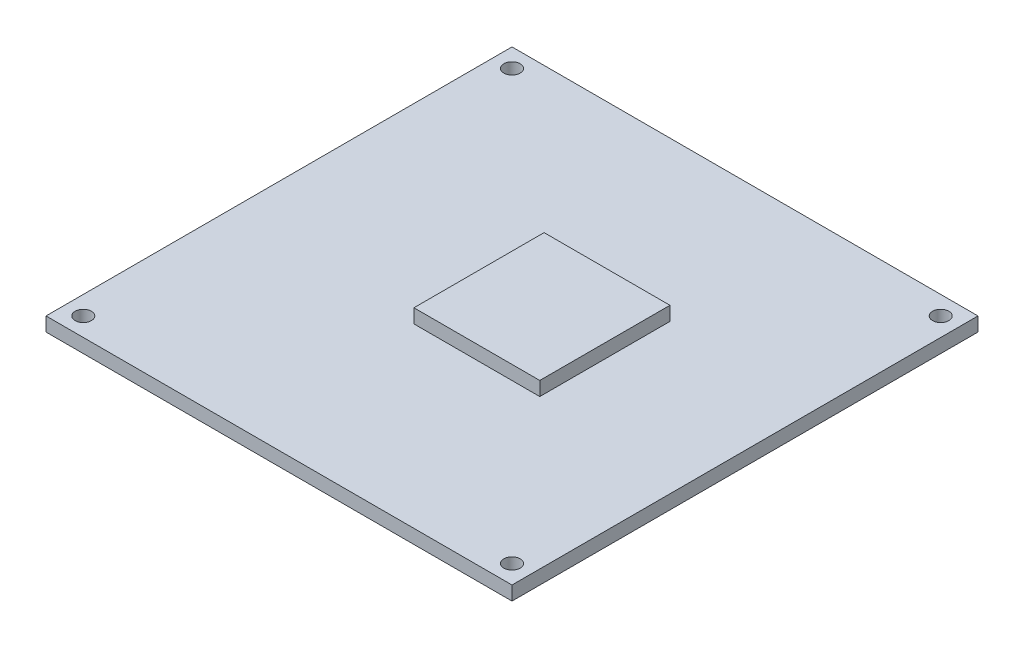
ISO-10303-21;
HEADER;
FILE_DESCRIPTION(('STEP AP214'),'2;1');
FILE_NAME('part.step','',(''),(''),'','','');
FILE_SCHEMA(('AUTOMOTIVE_DESIGN { 1 0 10303 214 1 1 1 1 }'));
ENDSEC;
DATA;
#1=APPLICATION_CONTEXT('core data for automotive mechanical design processes');
#2=APPLICATION_PROTOCOL_DEFINITION('international standard','automotive_design',2000,#1);
#3=PRODUCT_CONTEXT('',#1,'mechanical');
#4=PRODUCT('Part','Part','',(#3));
#5=PRODUCT_RELATED_PRODUCT_CATEGORY('part','',(#4));
#6=PRODUCT_DEFINITION_FORMATION('','',#4);
#7=PRODUCT_DEFINITION_CONTEXT('part definition',#1,'design');
#8=PRODUCT_DEFINITION('design','',#6,#7);
#9=PRODUCT_DEFINITION_SHAPE('','',#8);
#10=(LENGTH_UNIT() NAMED_UNIT(*) SI_UNIT(.MILLI.,.METRE.));
#11=(NAMED_UNIT(*) PLANE_ANGLE_UNIT() SI_UNIT($,.RADIAN.));
#12=(NAMED_UNIT(*) SI_UNIT($,.STERADIAN.) SOLID_ANGLE_UNIT());
#13=UNCERTAINTY_MEASURE_WITH_UNIT(LENGTH_MEASURE(1.E-05),#10,'distance_accuracy_value','');
#14=(GEOMETRIC_REPRESENTATION_CONTEXT(3) GLOBAL_UNCERTAINTY_ASSIGNED_CONTEXT((#13)) GLOBAL_UNIT_ASSIGNED_CONTEXT((#10,
#11,#12)) REPRESENTATION_CONTEXT('',''));
#15=CARTESIAN_POINT('',(0.,0.,0.));
#16=DIRECTION('',(0.,0.,1.));
#17=DIRECTION('',(1.,0.,0.));
#18=AXIS2_PLACEMENT_3D('',#15,#16,#17);
#19=CARTESIAN_POINT('',(0.,3.,0.));
#20=DIRECTION('',(0.,1.,0.));
#21=DIRECTION('',(0.,0.,1.));
#22=AXIS2_PLACEMENT_3D('',#19,#20,#21);
#23=PLANE('',#22);
#24=CARTESIAN_POINT('',(-46.,3.,46.));
#25=DIRECTION('',(0.,1.,0.));
#26=DIRECTION('',(0.,0.,1.));
#27=AXIS2_PLACEMENT_3D('',#24,#25,#26);
#28=CIRCLE('',#27,1.75);
#29=CARTESIAN_POINT('',(-46.,3.,47.75));
#30=VERTEX_POINT('',#29);
#31=EDGE_CURVE('E145',#30,#30,#28,.T.);
#32=ORIENTED_EDGE('',*,*,#31,.F.);
#33=EDGE_LOOP('',(#32));
#34=FACE_BOUND('',#33,.T.);
#35=CARTESIAN_POINT('',(46.,3.,-46.));
#36=DIRECTION('',(0.,1.,0.));
#37=DIRECTION('',(0.,0.,1.));
#38=AXIS2_PLACEMENT_3D('',#35,#36,#37);
#39=CIRCLE('',#38,1.75);
#40=CARTESIAN_POINT('',(46.,3.,-44.25));
#41=VERTEX_POINT('',#40);
#42=EDGE_CURVE('E157',#41,#41,#39,.T.);
#43=ORIENTED_EDGE('',*,*,#42,.F.);
#44=EDGE_LOOP('',(#43));
#45=FACE_BOUND('',#44,.T.);
#46=DIRECTION('',(0.,0.,-1.));
#47=VECTOR('',#46,1.);
#48=CARTESIAN_POINT('',(50.,3.,-50.));
#49=LINE('',#48,#47);
#50=CARTESIAN_POINT('',(50.,3.,50.));
#51=VERTEX_POINT('',#50);
#52=CARTESIAN_POINT('',(50.,3.,-50.));
#53=VERTEX_POINT('',#52);
#54=EDGE_CURVE('E163',#51,#53,#49,.T.);
#55=ORIENTED_EDGE('',*,*,#54,.T.);
#56=DIRECTION('',(-1.,0.,0.));
#57=VECTOR('',#56,1.);
#58=CARTESIAN_POINT('',(-50.,3.,-50.));
#59=LINE('',#58,#57);
#60=CARTESIAN_POINT('',(-50.,3.,-50.));
#61=VERTEX_POINT('',#60);
#62=EDGE_CURVE('E87',#53,#61,#59,.T.);
#63=ORIENTED_EDGE('',*,*,#62,.T.);
#64=DIRECTION('',(0.,0.,1.));
#65=VECTOR('',#64,1.);
#66=CARTESIAN_POINT('',(-50.,3.,-50.));
#67=LINE('',#66,#65);
#68=CARTESIAN_POINT('',(-50.,3.,50.));
#69=VERTEX_POINT('',#68);
#70=EDGE_CURVE('E166',#61,#69,#67,.T.);
#71=ORIENTED_EDGE('',*,*,#70,.T.);
#72=DIRECTION('',(1.,0.,0.));
#73=VECTOR('',#72,1.);
#74=CARTESIAN_POINT('',(-50.,3.,50.));
#75=LINE('',#74,#73);
#76=EDGE_CURVE('E59',#69,#51,#75,.T.);
#77=ORIENTED_EDGE('',*,*,#76,.T.);
#78=EDGE_LOOP('',(#55,#63,#71,#77));
#79=FACE_BOUND('',#78,.T.);
#80=CARTESIAN_POINT('',(46.,3.,46.));
#81=DIRECTION('',(0.,1.,0.));
#82=DIRECTION('',(0.,0.,-1.));
#83=AXIS2_PLACEMENT_3D('',#80,#81,#82);
#84=CIRCLE('',#83,1.75);
#85=CARTESIAN_POINT('',(46.,3.,44.25));
#86=VERTEX_POINT('',#85);
#87=EDGE_CURVE('E151',#86,#86,#84,.T.);
#88=ORIENTED_EDGE('',*,*,#87,.F.);
#89=EDGE_LOOP('',(#88));
#90=FACE_BOUND('',#89,.T.);
#91=CARTESIAN_POINT('',(-46.,3.,-46.));
#92=DIRECTION('',(0.,1.,0.));
#93=DIRECTION('',(0.,0.,-1.));
#94=AXIS2_PLACEMENT_3D('',#91,#92,#93);
#95=CIRCLE('',#94,1.75);
#96=CARTESIAN_POINT('',(-46.,3.,-47.75));
#97=VERTEX_POINT('',#96);
#98=EDGE_CURVE('E137',#97,#97,#95,.T.);
#99=ORIENTED_EDGE('',*,*,#98,.F.);
#100=EDGE_LOOP('',(#99));
#101=FACE_BOUND('',#100,.T.);
#102=DIRECTION('',(1.,0.,0.));
#103=VECTOR('',#102,1.);
#104=CARTESIAN_POINT('',(-9.03983958771448,3.,12.0050234314704));
#105=LINE('',#104,#103);
#106=CARTESIAN_POINT('',(-9.03983958771448,3.,12.0050234314704));
#107=VERTEX_POINT('',#106);
#108=CARTESIAN_POINT('',(17.967257133165,3.,12.0050234314704));
#109=VERTEX_POINT('',#108);
#110=EDGE_CURVE('E333',#107,#109,#105,.T.);
#111=ORIENTED_EDGE('',*,*,#110,.F.);
#112=DIRECTION('',(0.,0.,1.));
#113=VECTOR('',#112,1.);
#114=CARTESIAN_POINT('',(-9.03983958771448,3.,12.0050234314704));
#115=LINE('',#114,#113);
#116=CARTESIAN_POINT('',(-9.03983958771448,3.,-15.9265379854787));
#117=VERTEX_POINT('',#116);
#118=EDGE_CURVE('E132',#117,#107,#115,.T.);
#119=ORIENTED_EDGE('',*,*,#118,.F.);
#120=DIRECTION('',(-1.,0.,0.));
#121=VECTOR('',#120,1.);
#122=CARTESIAN_POINT('',(-9.03983958771448,3.,-15.9265379854787));
#123=LINE('',#122,#121);
#124=CARTESIAN_POINT('',(17.967257133165,3.,-15.9265379854787));
#125=VERTEX_POINT('',#124);
#126=EDGE_CURVE('E128',#125,#117,#123,.T.);
#127=ORIENTED_EDGE('',*,*,#126,.F.);
#128=DIRECTION('',(0.,0.,-1.));
#129=VECTOR('',#128,1.);
#130=CARTESIAN_POINT('',(17.967257133165,3.,12.0050234314704));
#131=LINE('',#130,#129);
#132=EDGE_CURVE('E330',#109,#125,#131,.T.);
#133=ORIENTED_EDGE('',*,*,#132,.F.);
#134=EDGE_LOOP('',(#111,#119,#127,#133));
#135=FACE_BOUND('',#134,.T.);
#136=ADVANCED_FACE('F35',(#34,#45,#79,#90,#101,#135),#23,.T.);
#137=CARTESIAN_POINT('',(0.,0.,0.));
#138=DIRECTION('',(0.,1.,0.));
#139=DIRECTION('',(0.,0.,1.));
#140=AXIS2_PLACEMENT_3D('',#137,#138,#139);
#141=PLANE('',#140);
#142=DIRECTION('',(0.,0.,-1.));
#143=VECTOR('',#142,1.);
#144=CARTESIAN_POINT('',(50.,0.,-50.));
#145=LINE('',#144,#143);
#146=CARTESIAN_POINT('',(50.,0.,50.));
#147=VERTEX_POINT('',#146);
#148=CARTESIAN_POINT('',(50.,0.,-50.));
#149=VERTEX_POINT('',#148);
#150=EDGE_CURVE('E160',#147,#149,#145,.T.);
#151=ORIENTED_EDGE('',*,*,#150,.F.);
#152=DIRECTION('',(1.,0.,0.));
#153=VECTOR('',#152,1.);
#154=CARTESIAN_POINT('',(-50.,0.,50.));
#155=LINE('',#154,#153);
#156=CARTESIAN_POINT('',(-50.,0.,50.));
#157=VERTEX_POINT('',#156);
#158=EDGE_CURVE('E80',#157,#147,#155,.T.);
#159=ORIENTED_EDGE('',*,*,#158,.F.);
#160=DIRECTION('',(0.,0.,1.));
#161=VECTOR('',#160,1.);
#162=CARTESIAN_POINT('',(-50.,0.,-50.));
#163=LINE('',#162,#161);
#164=CARTESIAN_POINT('',(-50.,0.,-50.));
#165=VERTEX_POINT('',#164);
#166=EDGE_CURVE('E174',#165,#157,#163,.T.);
#167=ORIENTED_EDGE('',*,*,#166,.F.);
#168=DIRECTION('',(-1.,0.,0.));
#169=VECTOR('',#168,1.);
#170=CARTESIAN_POINT('',(-50.,0.,-50.));
#171=LINE('',#170,#169);
#172=EDGE_CURVE('E172',#149,#165,#171,.T.);
#173=ORIENTED_EDGE('',*,*,#172,.F.);
#174=EDGE_LOOP('',(#151,#159,#167,#173));
#175=FACE_BOUND('',#174,.T.);
#176=CARTESIAN_POINT('',(46.,0.,-46.));
#177=DIRECTION('',(0.,1.,0.));
#178=DIRECTION('',(0.,0.,1.));
#179=AXIS2_PLACEMENT_3D('',#176,#177,#178);
#180=CIRCLE('',#179,1.75);
#181=CARTESIAN_POINT('',(46.,0.,-44.25));
#182=VERTEX_POINT('',#181);
#183=EDGE_CURVE('E154',#182,#182,#180,.T.);
#184=ORIENTED_EDGE('',*,*,#183,.T.);
#185=EDGE_LOOP('',(#184));
#186=FACE_BOUND('',#185,.T.);
#187=CARTESIAN_POINT('',(46.,0.,46.));
#188=DIRECTION('',(0.,1.,0.));
#189=DIRECTION('',(0.,0.,-1.));
#190=AXIS2_PLACEMENT_3D('',#187,#188,#189);
#191=CIRCLE('',#190,1.75);
#192=CARTESIAN_POINT('',(46.,0.,44.25));
#193=VERTEX_POINT('',#192);
#194=EDGE_CURVE('E148',#193,#193,#191,.T.);
#195=ORIENTED_EDGE('',*,*,#194,.T.);
#196=EDGE_LOOP('',(#195));
#197=FACE_BOUND('',#196,.T.);
#198=CARTESIAN_POINT('',(-46.,0.,46.));
#199=DIRECTION('',(0.,1.,0.));
#200=DIRECTION('',(0.,0.,1.));
#201=AXIS2_PLACEMENT_3D('',#198,#199,#200);
#202=CIRCLE('',#201,1.75);
#203=CARTESIAN_POINT('',(-46.,0.,47.75));
#204=VERTEX_POINT('',#203);
#205=EDGE_CURVE('E143',#204,#204,#202,.T.);
#206=ORIENTED_EDGE('',*,*,#205,.T.);
#207=EDGE_LOOP('',(#206));
#208=FACE_BOUND('',#207,.T.);
#209=CARTESIAN_POINT('',(-46.,0.,-46.));
#210=DIRECTION('',(0.,1.,0.));
#211=DIRECTION('',(0.,0.,-1.));
#212=AXIS2_PLACEMENT_3D('',#209,#210,#211);
#213=CIRCLE('',#212,1.75);
#214=CARTESIAN_POINT('',(-46.,0.,-47.75));
#215=VERTEX_POINT('',#214);
#216=EDGE_CURVE('E134',#215,#215,#213,.T.);
#217=ORIENTED_EDGE('',*,*,#216,.T.);
#218=EDGE_LOOP('',(#217));
#219=FACE_BOUND('',#218,.T.);
#220=ADVANCED_FACE('F187',(#175,#186,#197,#208,#219),#141,.F.);
#221=CARTESIAN_POINT('',(50.,3.,-50.));
#222=DIRECTION('',(-1.,0.,0.));
#223=DIRECTION('',(0.,0.,1.));
#224=AXIS2_PLACEMENT_3D('',#221,#222,#223);
#225=PLANE('',#224);
#226=ORIENTED_EDGE('',*,*,#150,.T.);
#227=DIRECTION('',(0.,-1.,0.));
#228=VECTOR('',#227,1.);
#229=CARTESIAN_POINT('',(50.,3.,-50.));
#230=LINE('',#229,#228);
#231=EDGE_CURVE('E11',#53,#149,#230,.T.);
#232=ORIENTED_EDGE('',*,*,#231,.F.);
#233=ORIENTED_EDGE('',*,*,#54,.F.);
#234=DIRECTION('',(0.,-1.,0.));
#235=VECTOR('',#234,1.);
#236=CARTESIAN_POINT('',(50.,3.,50.));
#237=LINE('',#236,#235);
#238=EDGE_CURVE('E169',#51,#147,#237,.T.);
#239=ORIENTED_EDGE('',*,*,#238,.T.);
#240=EDGE_LOOP('',(#226,#232,#233,#239));
#241=FACE_BOUND('',#240,.T.);
#242=ADVANCED_FACE('F37',(#241),#225,.F.);
#243=CARTESIAN_POINT('',(-50.,3.,-50.));
#244=DIRECTION('',(0.,0.,1.));
#245=DIRECTION('',(1.,0.,0.));
#246=AXIS2_PLACEMENT_3D('',#243,#244,#245);
#247=PLANE('',#246);
#248=ORIENTED_EDGE('',*,*,#172,.T.);
#249=DIRECTION('',(0.,-1.,0.));
#250=VECTOR('',#249,1.);
#251=CARTESIAN_POINT('',(-50.,3.,-50.));
#252=LINE('',#251,#250);
#253=EDGE_CURVE('E43',#61,#165,#252,.T.);
#254=ORIENTED_EDGE('',*,*,#253,.F.);
#255=ORIENTED_EDGE('',*,*,#62,.F.);
#256=ORIENTED_EDGE('',*,*,#231,.T.);
#257=EDGE_LOOP('',(#248,#254,#255,#256));
#258=FACE_BOUND('',#257,.T.);
#259=ADVANCED_FACE('F203',(#258),#247,.F.);
#260=CARTESIAN_POINT('',(-50.,3.,-50.));
#261=DIRECTION('',(1.,0.,0.));
#262=DIRECTION('',(0.,0.,-1.));
#263=AXIS2_PLACEMENT_3D('',#260,#261,#262);
#264=PLANE('',#263);
#265=ORIENTED_EDGE('',*,*,#166,.T.);
#266=DIRECTION('',(0.,-1.,0.));
#267=VECTOR('',#266,1.);
#268=CARTESIAN_POINT('',(-50.,3.,50.));
#269=LINE('',#268,#267);
#270=EDGE_CURVE('E178',#69,#157,#269,.T.);
#271=ORIENTED_EDGE('',*,*,#270,.F.);
#272=ORIENTED_EDGE('',*,*,#70,.F.);
#273=ORIENTED_EDGE('',*,*,#253,.T.);
#274=EDGE_LOOP('',(#265,#271,#272,#273));
#275=FACE_BOUND('',#274,.T.);
#276=ADVANCED_FACE('F183',(#275),#264,.F.);
#277=CARTESIAN_POINT('',(-50.,3.,50.));
#278=DIRECTION('',(0.,0.,-1.));
#279=DIRECTION('',(-1.,0.,0.));
#280=AXIS2_PLACEMENT_3D('',#277,#278,#279);
#281=PLANE('',#280);
#282=ORIENTED_EDGE('',*,*,#158,.T.);
#283=ORIENTED_EDGE('',*,*,#238,.F.);
#284=ORIENTED_EDGE('',*,*,#76,.F.);
#285=ORIENTED_EDGE('',*,*,#270,.T.);
#286=EDGE_LOOP('',(#282,#283,#284,#285));
#287=FACE_BOUND('',#286,.T.);
#288=ADVANCED_FACE('F192',(#287),#281,.F.);
#289=CARTESIAN_POINT('',(46.,3.,-46.));
#290=DIRECTION('',(0.,-1.,0.));
#291=DIRECTION('',(0.,0.,-1.));
#292=AXIS2_PLACEMENT_3D('',#289,#290,#291);
#293=CYLINDRICAL_SURFACE('',#292,1.75);
#294=ORIENTED_EDGE('',*,*,#42,.T.);
#295=EDGE_LOOP('',(#294));
#296=FACE_BOUND('',#295,.T.);
#297=ORIENTED_EDGE('',*,*,#183,.F.);
#298=EDGE_LOOP('',(#297));
#299=FACE_BOUND('',#298,.T.);
#300=ADVANCED_FACE('F194',(#296,#299),#293,.F.);
#301=CARTESIAN_POINT('',(46.,3.,46.));
#302=DIRECTION('',(0.,-1.,0.));
#303=DIRECTION('',(0.,0.,-1.));
#304=AXIS2_PLACEMENT_3D('',#301,#302,#303);
#305=CYLINDRICAL_SURFACE('',#304,1.75);
#306=ORIENTED_EDGE('',*,*,#87,.T.);
#307=EDGE_LOOP('',(#306));
#308=FACE_BOUND('',#307,.T.);
#309=ORIENTED_EDGE('',*,*,#194,.F.);
#310=EDGE_LOOP('',(#309));
#311=FACE_BOUND('',#310,.T.);
#312=ADVANCED_FACE('F200',(#308,#311),#305,.F.);
#313=CARTESIAN_POINT('',(-46.,3.,46.));
#314=DIRECTION('',(0.,-1.,0.));
#315=DIRECTION('',(0.,0.,-1.));
#316=AXIS2_PLACEMENT_3D('',#313,#314,#315);
#317=CYLINDRICAL_SURFACE('',#316,1.75);
#318=ORIENTED_EDGE('',*,*,#31,.T.);
#319=EDGE_LOOP('',(#318));
#320=FACE_BOUND('',#319,.T.);
#321=ORIENTED_EDGE('',*,*,#205,.F.);
#322=EDGE_LOOP('',(#321));
#323=FACE_BOUND('',#322,.T.);
#324=ADVANCED_FACE('F217',(#320,#323),#317,.F.);
#325=CARTESIAN_POINT('',(-46.,3.,-46.));
#326=DIRECTION('',(0.,-1.,0.));
#327=DIRECTION('',(0.,0.,-1.));
#328=AXIS2_PLACEMENT_3D('',#325,#326,#327);
#329=CYLINDRICAL_SURFACE('',#328,1.75);
#330=ORIENTED_EDGE('',*,*,#98,.T.);
#331=EDGE_LOOP('',(#330));
#332=FACE_BOUND('',#331,.T.);
#333=ORIENTED_EDGE('',*,*,#216,.F.);
#334=EDGE_LOOP('',(#333));
#335=FACE_BOUND('',#334,.T.);
#336=ADVANCED_FACE('F221',(#332,#335),#329,.F.);
#337=CARTESIAN_POINT('',(-9.03983958771448,6.,12.0050234314704));
#338=DIRECTION('',(1.,0.,0.));
#339=DIRECTION('',(0.,0.,-1.));
#340=AXIS2_PLACEMENT_3D('',#337,#338,#339);
#341=PLANE('',#340);
#342=ORIENTED_EDGE('',*,*,#118,.T.);
#343=DIRECTION('',(0.,-1.,0.));
#344=VECTOR('',#343,1.);
#345=CARTESIAN_POINT('',(-9.03983958771448,6.,12.0050234314704));
#346=LINE('',#345,#344);
#347=CARTESIAN_POINT('',(-9.03983958771448,6.,12.0050234314704));
#348=VERTEX_POINT('',#347);
#349=EDGE_CURVE('E113',#348,#107,#346,.T.);
#350=ORIENTED_EDGE('',*,*,#349,.F.);
#351=DIRECTION('',(0.,0.,1.));
#352=VECTOR('',#351,1.);
#353=CARTESIAN_POINT('',(-9.03983958771448,6.,12.0050234314704));
#354=LINE('',#353,#352);
#355=CARTESIAN_POINT('',(-9.03983958771448,6.,-15.9265379854787));
#356=VERTEX_POINT('',#355);
#357=EDGE_CURVE('E120',#356,#348,#354,.T.);
#358=ORIENTED_EDGE('',*,*,#357,.F.);
#359=DIRECTION('',(0.,-1.,0.));
#360=VECTOR('',#359,1.);
#361=CARTESIAN_POINT('',(-9.03983958771448,6.,-15.9265379854787));
#362=LINE('',#361,#360);
#363=EDGE_CURVE('E327',#356,#117,#362,.T.);
#364=ORIENTED_EDGE('',*,*,#363,.T.);
#365=EDGE_LOOP('',(#342,#350,#358,#364));
#366=FACE_BOUND('',#365,.T.);
#367=ADVANCED_FACE('F130',(#366),#341,.F.);
#368=CARTESIAN_POINT('',(-9.03983958771448,6.,12.0050234314704));
#369=DIRECTION('',(0.,0.,-1.));
#370=DIRECTION('',(-1.,0.,0.));
#371=AXIS2_PLACEMENT_3D('',#368,#369,#370);
#372=PLANE('',#371);
#373=ORIENTED_EDGE('',*,*,#110,.T.);
#374=DIRECTION('',(0.,-1.,0.));
#375=VECTOR('',#374,1.);
#376=CARTESIAN_POINT('',(17.967257133165,6.,12.0050234314704));
#377=LINE('',#376,#375);
#378=CARTESIAN_POINT('',(17.967257133165,6.,12.0050234314704));
#379=VERTEX_POINT('',#378);
#380=EDGE_CURVE('E116',#379,#109,#377,.T.);
#381=ORIENTED_EDGE('',*,*,#380,.F.);
#382=DIRECTION('',(1.,0.,0.));
#383=VECTOR('',#382,1.);
#384=CARTESIAN_POINT('',(-9.03983958771448,6.,12.0050234314704));
#385=LINE('',#384,#383);
#386=EDGE_CURVE('E109',#348,#379,#385,.T.);
#387=ORIENTED_EDGE('',*,*,#386,.F.);
#388=ORIENTED_EDGE('',*,*,#349,.T.);
#389=EDGE_LOOP('',(#373,#381,#387,#388));
#390=FACE_BOUND('',#389,.T.);
#391=ADVANCED_FACE('F111',(#390),#372,.F.);
#392=CARTESIAN_POINT('',(17.967257133165,6.,12.0050234314704));
#393=DIRECTION('',(-1.,0.,0.));
#394=DIRECTION('',(0.,0.,1.));
#395=AXIS2_PLACEMENT_3D('',#392,#393,#394);
#396=PLANE('',#395);
#397=ORIENTED_EDGE('',*,*,#132,.T.);
#398=DIRECTION('',(0.,-1.,0.));
#399=VECTOR('',#398,1.);
#400=CARTESIAN_POINT('',(17.967257133165,6.,-15.9265379854787));
#401=LINE('',#400,#399);
#402=CARTESIAN_POINT('',(17.967257133165,6.,-15.9265379854787));
#403=VERTEX_POINT('',#402);
#404=EDGE_CURVE('E50',#403,#125,#401,.T.);
#405=ORIENTED_EDGE('',*,*,#404,.F.);
#406=DIRECTION('',(0.,0.,-1.));
#407=VECTOR('',#406,1.);
#408=CARTESIAN_POINT('',(17.967257133165,6.,12.0050234314704));
#409=LINE('',#408,#407);
#410=EDGE_CURVE('E119',#379,#403,#409,.T.);
#411=ORIENTED_EDGE('',*,*,#410,.F.);
#412=ORIENTED_EDGE('',*,*,#380,.T.);
#413=EDGE_LOOP('',(#397,#405,#411,#412));
#414=FACE_BOUND('',#413,.T.);
#415=ADVANCED_FACE('F230',(#414),#396,.F.);
#416=CARTESIAN_POINT('',(-9.03983958771448,6.,-15.9265379854787));
#417=DIRECTION('',(0.,0.,1.));
#418=DIRECTION('',(1.,0.,0.));
#419=AXIS2_PLACEMENT_3D('',#416,#417,#418);
#420=PLANE('',#419);
#421=ORIENTED_EDGE('',*,*,#126,.T.);
#422=ORIENTED_EDGE('',*,*,#363,.F.);
#423=DIRECTION('',(-1.,0.,0.));
#424=VECTOR('',#423,1.);
#425=CARTESIAN_POINT('',(-9.03983958771448,6.,-15.9265379854787));
#426=LINE('',#425,#424);
#427=EDGE_CURVE('E124',#403,#356,#426,.T.);
#428=ORIENTED_EDGE('',*,*,#427,.F.);
#429=ORIENTED_EDGE('',*,*,#404,.T.);
#430=EDGE_LOOP('',(#421,#422,#428,#429));
#431=FACE_BOUND('',#430,.T.);
#432=ADVANCED_FACE('F233',(#431),#420,.F.);
#433=CARTESIAN_POINT('',(0.,6.,0.));
#434=DIRECTION('',(0.,-1.,0.));
#435=DIRECTION('',(0.,0.,-1.));
#436=AXIS2_PLACEMENT_3D('',#433,#434,#435);
#437=PLANE('',#436);
#438=ORIENTED_EDGE('',*,*,#357,.T.);
#439=ORIENTED_EDGE('',*,*,#386,.T.);
#440=ORIENTED_EDGE('',*,*,#410,.T.);
#441=ORIENTED_EDGE('',*,*,#427,.T.);
#442=EDGE_LOOP('',(#438,#439,#440,#441));
#443=FACE_BOUND('',#442,.T.);
#444=ADVANCED_FACE('F123',(#443),#437,.F.);
#445=CLOSED_SHELL('',(#136,#220,#242,#259,#276,#288,#300,#312,#324,#336,#367,#391,#415,#432,#444));
#446=MANIFOLD_SOLID_BREP('B2',#445);
#447=ADVANCED_BREP_SHAPE_REPRESENTATION('',(#18,#446),#14);
#448=SHAPE_DEFINITION_REPRESENTATION(#9,#447);
ENDSEC;
END-ISO-10303-21;
